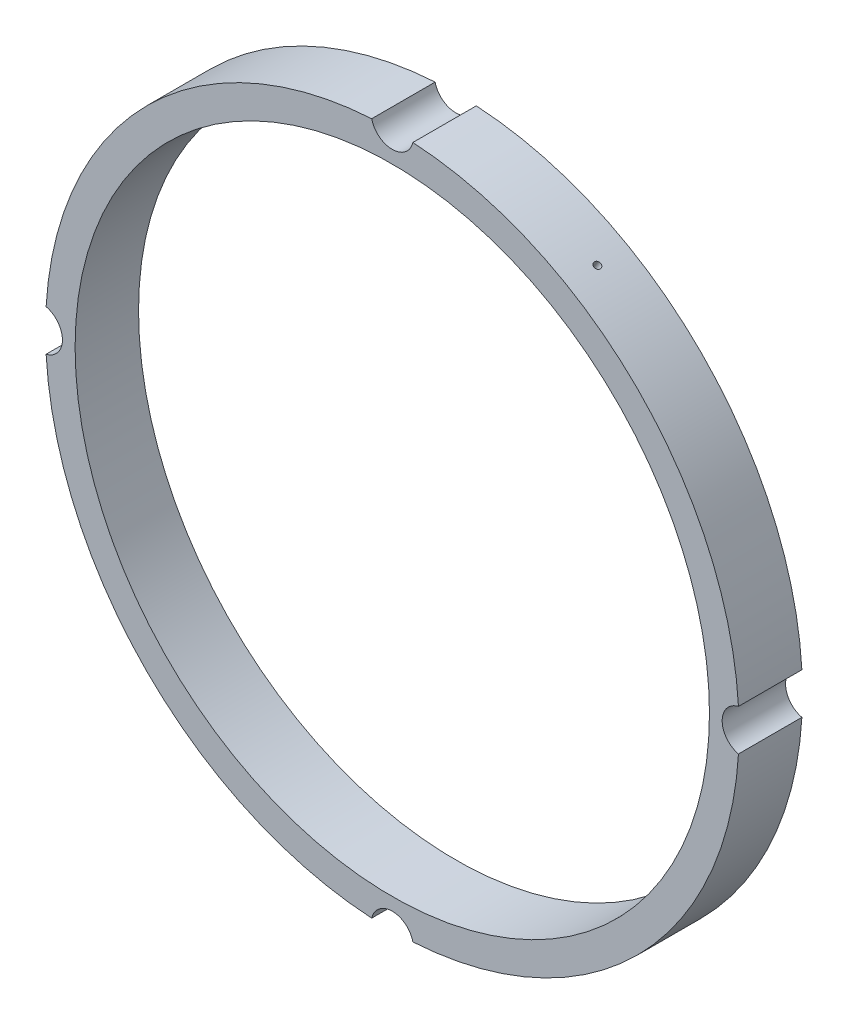
ISO-10303-21;
HEADER;
FILE_DESCRIPTION(('STEP AP214'),'2;1');
FILE_NAME('part.step','',(''),(''),'','','');
FILE_SCHEMA(('AUTOMOTIVE_DESIGN { 1 0 10303 214 1 1 1 1 }'));
ENDSEC;
DATA;
#1=APPLICATION_CONTEXT('core data for automotive mechanical design processes');
#2=APPLICATION_PROTOCOL_DEFINITION('international standard','automotive_design',2000,#1);
#3=PRODUCT_CONTEXT('',#1,'mechanical');
#4=PRODUCT('Part','Part','',(#3));
#5=PRODUCT_RELATED_PRODUCT_CATEGORY('part','',(#4));
#6=PRODUCT_DEFINITION_FORMATION('','',#4);
#7=PRODUCT_DEFINITION_CONTEXT('part definition',#1,'design');
#8=PRODUCT_DEFINITION('design','',#6,#7);
#9=PRODUCT_DEFINITION_SHAPE('','',#8);
#10=(LENGTH_UNIT() NAMED_UNIT(*) SI_UNIT(.MILLI.,.METRE.));
#11=(NAMED_UNIT(*) PLANE_ANGLE_UNIT() SI_UNIT($,.RADIAN.));
#12=(NAMED_UNIT(*) SI_UNIT($,.STERADIAN.) SOLID_ANGLE_UNIT());
#13=UNCERTAINTY_MEASURE_WITH_UNIT(LENGTH_MEASURE(1.E-05),#10,'distance_accuracy_value','');
#14=(GEOMETRIC_REPRESENTATION_CONTEXT(3) GLOBAL_UNCERTAINTY_ASSIGNED_CONTEXT((#13)) GLOBAL_UNIT_ASSIGNED_CONTEXT((#10,
#11,#12)) REPRESENTATION_CONTEXT('',''));
#15=CARTESIAN_POINT('',(0.,0.,0.));
#16=DIRECTION('',(0.,0.,1.));
#17=DIRECTION('',(1.,0.,0.));
#18=AXIS2_PLACEMENT_3D('',#15,#16,#17);
#19=CARTESIAN_POINT('',(0.,0.,15.));
#20=DIRECTION('',(0.,0.,-1.));
#21=DIRECTION('',(-1.,0.,0.));
#22=AXIS2_PLACEMENT_3D('',#19,#20,#21);
#23=CYLINDRICAL_SURFACE('',#22,82.);
#24=CARTESIAN_POINT('',(0.,0.,0.));
#25=DIRECTION('',(0.,0.,1.));
#26=DIRECTION('',(1.,0.,0.));
#27=AXIS2_PLACEMENT_3D('',#24,#25,#26);
#28=CIRCLE('',#27,82.);
#29=CARTESIAN_POINT('',(-4.86723129559619,81.855421686747,0.));
#30=VERTEX_POINT('',#29);
#31=CARTESIAN_POINT('',(-81.8554216867469,4.86723129559705,0.));
#32=VERTEX_POINT('',#31);
#33=EDGE_CURVE('E123',#30,#32,#28,.T.);
#34=ORIENTED_EDGE('',*,*,#33,.T.);
#35=DIRECTION('',(0.,0.,1.));
#36=VECTOR('',#35,1.);
#37=CARTESIAN_POINT('',(-81.8554216867469,4.86723129559704,7.5));
#38=LINE('',#37,#36);
#39=CARTESIAN_POINT('',(-81.8554216867469,4.86723129559704,15.));
#40=VERTEX_POINT('',#39);
#41=EDGE_CURVE('E56',#32,#40,#38,.T.);
#42=ORIENTED_EDGE('',*,*,#41,.T.);
#43=CARTESIAN_POINT('',(0.,0.,15.));
#44=DIRECTION('',(0.,0.,1.));
#45=DIRECTION('',(1.,0.,0.));
#46=AXIS2_PLACEMENT_3D('',#43,#44,#45);
#47=CIRCLE('',#46,82.);
#48=CARTESIAN_POINT('',(-4.86723129559619,81.855421686747,15.));
#49=VERTEX_POINT('',#48);
#50=EDGE_CURVE('E130',#49,#40,#47,.T.);
#51=ORIENTED_EDGE('',*,*,#50,.F.);
#52=DIRECTION('',(0.,0.,1.));
#53=VECTOR('',#52,1.);
#54=CARTESIAN_POINT('',(-4.86723129559619,81.855421686747,7.5));
#55=LINE('',#54,#53);
#56=EDGE_CURVE('E132',#49,#30,#55,.F.);
#57=ORIENTED_EDGE('',*,*,#56,.T.);
#58=EDGE_LOOP('',(#34,#42,#51,#57));
#59=FACE_BOUND('',#58,.T.);
#60=ADVANCED_FACE('F37',(#59),#23,.T.);
#61=CARTESIAN_POINT('',(-81.8554216867471,-4.86723129559533,15.));
#62=VERTEX_POINT('',#61);
#63=CARTESIAN_POINT('',(-4.86723129559619,-81.855421686747,15.));
#64=VERTEX_POINT('',#63);
#65=EDGE_CURVE('E116',#62,#64,#47,.T.);
#66=ORIENTED_EDGE('',*,*,#65,.F.);
#67=DIRECTION('',(0.,0.,1.));
#68=VECTOR('',#67,1.);
#69=CARTESIAN_POINT('',(-81.8554216867471,-4.86723129559533,7.5));
#70=LINE('',#69,#68);
#71=CARTESIAN_POINT('',(-81.8554216867471,-4.86723129559533,0.));
#72=VERTEX_POINT('',#71);
#73=EDGE_CURVE('E107',#62,#72,#70,.F.);
#74=ORIENTED_EDGE('',*,*,#73,.T.);
#75=CARTESIAN_POINT('',(-4.86723129559619,-81.855421686747,0.));
#76=VERTEX_POINT('',#75);
#77=EDGE_CURVE('E64',#72,#76,#28,.T.);
#78=ORIENTED_EDGE('',*,*,#77,.T.);
#79=DIRECTION('',(0.,0.,1.));
#80=VECTOR('',#79,1.);
#81=CARTESIAN_POINT('',(-4.86723129559619,-81.855421686747,7.5));
#82=LINE('',#81,#80);
#83=EDGE_CURVE('E161',#76,#64,#82,.T.);
#84=ORIENTED_EDGE('',*,*,#83,.T.);
#85=EDGE_LOOP('',(#66,#74,#78,#84));
#86=FACE_BOUND('',#85,.T.);
#87=ADVANCED_FACE('F115',(#86),#23,.T.);
#88=CARTESIAN_POINT('',(4.86723129559619,-81.855421686747,15.));
#89=VERTEX_POINT('',#88);
#90=CARTESIAN_POINT('',(81.855421686747,-4.86723129559647,15.));
#91=VERTEX_POINT('',#90);
#92=EDGE_CURVE('E146',#89,#91,#47,.T.);
#93=ORIENTED_EDGE('',*,*,#92,.F.);
#94=DIRECTION('',(0.,0.,1.));
#95=VECTOR('',#94,1.);
#96=CARTESIAN_POINT('',(4.86723129559619,-81.855421686747,7.5));
#97=LINE('',#96,#95);
#98=CARTESIAN_POINT('',(4.86723129559619,-81.855421686747,0.));
#99=VERTEX_POINT('',#98);
#100=EDGE_CURVE('E214',#89,#99,#97,.F.);
#101=ORIENTED_EDGE('',*,*,#100,.T.);
#102=CARTESIAN_POINT('',(81.855421686747,-4.86723129559647,0.));
#103=VERTEX_POINT('',#102);
#104=EDGE_CURVE('E124',#99,#103,#28,.T.);
#105=ORIENTED_EDGE('',*,*,#104,.T.);
#106=DIRECTION('',(0.,0.,1.));
#107=VECTOR('',#106,1.);
#108=CARTESIAN_POINT('',(81.855421686747,-4.86723129559647,7.5));
#109=LINE('',#108,#107);
#110=EDGE_CURVE('E49',#103,#91,#109,.T.);
#111=ORIENTED_EDGE('',*,*,#110,.T.);
#112=EDGE_LOOP('',(#93,#101,#105,#111));
#113=FACE_BOUND('',#112,.T.);
#114=ADVANCED_FACE('F144',(#113),#23,.T.);
#115=CARTESIAN_POINT('',(0.,0.,15.));
#116=DIRECTION('',(0.,0.,1.));
#117=DIRECTION('',(1.,0.,0.));
#118=AXIS2_PLACEMENT_3D('',#115,#116,#117);
#119=PLANE('',#118);
#120=CARTESIAN_POINT('',(-83.,8.6937885337194E-13,15.));
#121=DIRECTION('',(0.,0.,1.));
#122=DIRECTION('',(0.,1.,0.));
#123=AXIS2_PLACEMENT_3D('',#120,#121,#122);
#124=CIRCLE('',#123,5.);
#125=EDGE_CURVE('E112',#62,#40,#124,.T.);
#126=ORIENTED_EDGE('',*,*,#125,.F.);
#127=ORIENTED_EDGE('',*,*,#65,.T.);
#128=CARTESIAN_POINT('',(0.,-83.,15.));
#129=DIRECTION('',(0.,0.,1.));
#130=DIRECTION('',(-1.,0.,0.));
#131=AXIS2_PLACEMENT_3D('',#128,#129,#130);
#132=CIRCLE('',#131,5.);
#133=EDGE_CURVE('E206',#89,#64,#132,.T.);
#134=ORIENTED_EDGE('',*,*,#133,.F.);
#135=ORIENTED_EDGE('',*,*,#92,.T.);
#136=CARTESIAN_POINT('',(83.,-2.8979295112398E-13,15.));
#137=DIRECTION('',(0.,0.,1.));
#138=DIRECTION('',(0.,-1.,0.));
#139=AXIS2_PLACEMENT_3D('',#136,#137,#138);
#140=CIRCLE('',#139,5.);
#141=CARTESIAN_POINT('',(81.855421686747,4.8672312955959,15.));
#142=VERTEX_POINT('',#141);
#143=EDGE_CURVE('E153',#142,#91,#140,.T.);
#144=ORIENTED_EDGE('',*,*,#143,.F.);
#145=CARTESIAN_POINT('',(4.86723129559619,81.855421686747,15.));
#146=VERTEX_POINT('',#145);
#147=EDGE_CURVE('E126',#142,#146,#47,.T.);
#148=ORIENTED_EDGE('',*,*,#147,.T.);
#149=CARTESIAN_POINT('',(0.,83.,15.));
#150=DIRECTION('',(0.,0.,1.));
#151=DIRECTION('',(1.,0.,0.));
#152=AXIS2_PLACEMENT_3D('',#149,#150,#151);
#153=CIRCLE('',#152,5.);
#154=EDGE_CURVE('E156',#49,#146,#153,.T.);
#155=ORIENTED_EDGE('',*,*,#154,.F.);
#156=ORIENTED_EDGE('',*,*,#50,.T.);
#157=EDGE_LOOP('',(#126,#127,#134,#135,#144,#148,#155,#156));
#158=FACE_BOUND('',#157,.T.);
#159=CARTESIAN_POINT('',(0.,0.,15.));
#160=DIRECTION('',(0.,0.,1.));
#161=DIRECTION('',(1.,0.,0.));
#162=AXIS2_PLACEMENT_3D('',#159,#160,#161);
#163=CIRCLE('',#162,75.);
#164=CARTESIAN_POINT('',(75.,0.,15.));
#165=VERTEX_POINT('',#164);
#166=EDGE_CURVE('E168',#165,#165,#163,.T.);
#167=ORIENTED_EDGE('',*,*,#166,.F.);
#168=EDGE_LOOP('',(#167));
#169=FACE_BOUND('',#168,.T.);
#170=ADVANCED_FACE('F202',(#158,#169),#119,.T.);
#171=CARTESIAN_POINT('',(0.,0.,0.));
#172=DIRECTION('',(0.,0.,1.));
#173=DIRECTION('',(1.,0.,0.));
#174=AXIS2_PLACEMENT_3D('',#171,#172,#173);
#175=PLANE('',#174);
#176=ORIENTED_EDGE('',*,*,#77,.F.);
#177=CARTESIAN_POINT('',(-83.,8.6937885337194E-13,0.));
#178=DIRECTION('',(0.,0.,1.));
#179=DIRECTION('',(0.,1.,0.));
#180=AXIS2_PLACEMENT_3D('',#177,#178,#179);
#181=CIRCLE('',#180,5.);
#182=EDGE_CURVE('E105',#72,#32,#181,.T.);
#183=ORIENTED_EDGE('',*,*,#182,.T.);
#184=ORIENTED_EDGE('',*,*,#33,.F.);
#185=CARTESIAN_POINT('',(0.,83.,0.));
#186=DIRECTION('',(0.,0.,1.));
#187=DIRECTION('',(1.,0.,0.));
#188=AXIS2_PLACEMENT_3D('',#185,#186,#187);
#189=CIRCLE('',#188,5.);
#190=CARTESIAN_POINT('',(4.86723129559619,81.855421686747,0.));
#191=VERTEX_POINT('',#190);
#192=EDGE_CURVE('E159',#30,#191,#189,.T.);
#193=ORIENTED_EDGE('',*,*,#192,.T.);
#194=CARTESIAN_POINT('',(81.855421686747,4.8672312955959,0.));
#195=VERTEX_POINT('',#194);
#196=EDGE_CURVE('E127',#195,#191,#28,.T.);
#197=ORIENTED_EDGE('',*,*,#196,.F.);
#198=CARTESIAN_POINT('',(83.,-2.8979295112398E-13,0.));
#199=DIRECTION('',(0.,0.,1.));
#200=DIRECTION('',(0.,-1.,0.));
#201=AXIS2_PLACEMENT_3D('',#198,#199,#200);
#202=CIRCLE('',#201,5.);
#203=EDGE_CURVE('E151',#195,#103,#202,.T.);
#204=ORIENTED_EDGE('',*,*,#203,.T.);
#205=ORIENTED_EDGE('',*,*,#104,.F.);
#206=CARTESIAN_POINT('',(0.,-83.,0.));
#207=DIRECTION('',(0.,0.,1.));
#208=DIRECTION('',(-1.,0.,0.));
#209=AXIS2_PLACEMENT_3D('',#206,#207,#208);
#210=CIRCLE('',#209,5.);
#211=EDGE_CURVE('E122',#99,#76,#210,.T.);
#212=ORIENTED_EDGE('',*,*,#211,.T.);
#213=EDGE_LOOP('',(#176,#183,#184,#193,#197,#204,#205,#212));
#214=FACE_BOUND('',#213,.T.);
#215=CARTESIAN_POINT('',(0.,0.,0.));
#216=DIRECTION('',(0.,0.,1.));
#217=DIRECTION('',(1.,0.,0.));
#218=AXIS2_PLACEMENT_3D('',#215,#216,#217);
#219=CIRCLE('',#218,75.);
#220=CARTESIAN_POINT('',(75.,0.,0.));
#221=VERTEX_POINT('',#220);
#222=EDGE_CURVE('E166',#221,#221,#219,.T.);
#223=ORIENTED_EDGE('',*,*,#222,.T.);
#224=EDGE_LOOP('',(#223));
#225=FACE_BOUND('',#224,.T.);
#226=ADVANCED_FACE('F119',(#214,#225),#175,.F.);
#227=CARTESIAN_POINT('',(40.3052284110281,71.4107034185693,7.5));
#228=CARTESIAN_POINT('',(40.305230162785,71.4107024681233,7.45506479609301));
#229=CARTESIAN_POINT('',(40.3085368078791,71.40883642493,7.41009703714874));
#230=CARTESIAN_POINT('',(40.3216802135916,71.4014156688339,7.32140003350558));
#231=CARTESIAN_POINT('',(40.3315248278901,71.3958565196163,7.2776723443821));
#232=CARTESIAN_POINT('',(40.3574592527584,71.3811999286591,7.19275330768963));
#233=CARTESIAN_POINT('',(40.3735460727166,71.3721041812829,7.15156075648079));
#234=CARTESIAN_POINT('',(40.4114971299767,71.3506227921757,7.07287429083479));
#235=CARTESIAN_POINT('',(40.4333599334488,71.3382379669211,7.03537946164327));
#236=CARTESIAN_POINT('',(40.4822388609424,71.3105120161913,6.9651344354136));
#237=CARTESIAN_POINT('',(40.5092556770344,71.2951704936937,6.93238487660122));
#238=CARTESIAN_POINT('',(40.5676657214676,71.2619507473826,6.87256517048709));
#239=CARTESIAN_POINT('',(40.59905912185,71.2440724238483,6.84549524655357));
#240=CARTESIAN_POINT('',(40.6653214679689,71.2062713712898,6.79780471692709));
#241=CARTESIAN_POINT('',(40.7001904182244,71.1863486396075,6.77718411961991));
#242=CARTESIAN_POINT('',(40.772406334745,71.1450111456782,6.74297779787522));
#243=CARTESIAN_POINT('',(40.8097532955037,71.1235963867468,6.72939205780614));
#244=CARTESIAN_POINT('',(40.8858585322044,71.0798740635081,6.70964144378451));
#245=CARTESIAN_POINT('',(40.9246167652487,71.0575665263361,6.70347634446412));
#246=CARTESIAN_POINT('',(41.0024427076472,71.0126869615936,6.69874133559804));
#247=CARTESIAN_POINT('',(41.0415104163721,70.9901149345609,6.70017141060814));
#248=CARTESIAN_POINT('',(41.1188455717403,70.945348935138,6.71058592631372));
#249=CARTESIAN_POINT('',(41.1571130452983,70.9231549500377,6.71957011251892));
#250=CARTESIAN_POINT('',(41.2317665366884,70.8797805669154,6.7448374350582));
#251=CARTESIAN_POINT('',(41.2681525523058,70.8586001700864,6.76112057998316));
#252=CARTESIAN_POINT('',(41.3380172194721,70.8178647619419,6.80052388209611));
#253=CARTESIAN_POINT('',(41.3714958216182,70.7983097782456,6.82364415543103));
#254=CARTESIAN_POINT('',(41.434603016724,70.7613949232539,6.87606530348475));
#255=CARTESIAN_POINT('',(41.4642316101463,70.7440350516948,6.90536617746084));
#256=CARTESIAN_POINT('',(41.5188083007378,70.7120185025764,6.9693182281911));
#257=CARTESIAN_POINT('',(41.5437562021976,70.6973619380483,7.00396962855131));
#258=CARTESIAN_POINT('',(41.5882710512857,70.6711849340483,7.07763829735254));
#259=CARTESIAN_POINT('',(41.6078379981956,70.6596644949952,7.11665556637643));
#260=CARTESIAN_POINT('',(41.641043626485,70.640100926749,7.19794850712354));
#261=CARTESIAN_POINT('',(41.6546823022913,70.6320578008251,7.24022418191001));
#262=CARTESIAN_POINT('',(41.6756502729947,70.6196879331484,7.3268337992777));
#263=CARTESIAN_POINT('',(41.6829795699621,70.6153611901761,7.37116774118354));
#264=CARTESIAN_POINT('',(41.6911239668386,70.6105530728755,7.46063342804992));
#265=CARTESIAN_POINT('',(41.6919393353669,70.6100715399797,7.50576514003536));
#266=CARTESIAN_POINT('',(41.6870338226723,70.6129677812092,7.59554693556317));
#267=CARTESIAN_POINT('',(41.6813129419862,70.6163455550177,7.64019701914508));
#268=CARTESIAN_POINT('',(41.6634948178797,70.6268596602105,7.72774720890134));
#269=CARTESIAN_POINT('',(41.6513976958952,70.6339959200141,7.77064734838672));
#270=CARTESIAN_POINT('',(41.6211650638207,70.6518147314161,7.8534808607507));
#271=CARTESIAN_POINT('',(41.6030295531477,70.6624972833568,7.89341423334282));
#272=CARTESIAN_POINT('',(41.5612265203059,70.6870924286367,7.96918206255699));
#273=CARTESIAN_POINT('',(41.537558817141,70.7010051276562,8.00501638501377));
#274=CARTESIAN_POINT('',(41.4853544455829,70.7316497769729,8.07156755198845));
#275=CARTESIAN_POINT('',(41.4568177741148,70.7483817290505,8.10228439327472));
#276=CARTESIAN_POINT('',(41.3956750206665,70.7841743762166,8.15772966893016));
#277=CARTESIAN_POINT('',(41.3630688010143,70.8032351500882,8.18245790062276));
#278=CARTESIAN_POINT('',(41.2947046718655,70.8431290267123,8.22522259144113));
#279=CARTESIAN_POINT('',(41.2589467660966,70.8639621273686,8.24325905848161));
#280=CARTESIAN_POINT('',(41.1852880913143,70.9067969831621,8.27212789441348));
#281=CARTESIAN_POINT('',(41.1473873619883,70.9287987166545,8.2829603966825));
#282=CARTESIAN_POINT('',(41.0705139344065,70.9733390629306,8.29711425167829));
#283=CARTESIAN_POINT('',(41.0315412345227,70.9958776765296,8.30043559299621));
#284=CARTESIAN_POINT('',(40.9536306752187,71.0408485140235,8.29947279646204));
#285=CARTESIAN_POINT('',(40.9146928143604,71.0632807424909,8.2951889885238));
#286=CARTESIAN_POINT('',(40.8379572703114,71.1074061241529,8.279138152379));
#287=CARTESIAN_POINT('',(40.8001595894107,71.129099275863,8.26737110914375));
#288=CARTESIAN_POINT('',(40.7267814451327,71.1711392536284,8.23668763250792));
#289=CARTESIAN_POINT('',(40.6912010228659,71.1914860547211,8.21777106659268));
#290=CARTESIAN_POINT('',(40.6232765406942,71.2302669838026,8.17332635454546));
#291=CARTESIAN_POINT('',(40.5909323548439,71.2487011862253,8.14779846584659));
#292=CARTESIAN_POINT('',(40.5304074104666,71.2831487094411,8.09085755066491));
#293=CARTESIAN_POINT('',(40.5022263893502,71.2991621829217,8.05944489564427));
#294=CARTESIAN_POINT('',(40.4508278504761,71.328335198352,7.99161477008843));
#295=CARTESIAN_POINT('',(40.4276115676375,71.3414940302556,7.95519605804872));
#296=CARTESIAN_POINT('',(40.3868099222115,71.3646000206399,7.87838044791628));
#297=CARTESIAN_POINT('',(40.3692273551643,71.3745455846659,7.83798158776967));
#298=CARTESIAN_POINT('',(40.340231691055,71.3909377104108,7.75439747070503));
#299=CARTESIAN_POINT('',(40.3288112020707,71.3973884644812,7.71121562216788));
#300=CARTESIAN_POINT('',(40.3155112248783,71.4048988976244,7.63979902324665));
#301=CARTESIAN_POINT('',(40.3116600520628,71.4070729879977,7.61202827082364));
#302=CARTESIAN_POINT('',(40.3065180975612,71.4099755455663,7.55617592082972));
#303=CARTESIAN_POINT('',(40.3052273157971,71.4107040128057,7.52809432326828));
#304=CARTESIAN_POINT('',(40.3052284110281,71.4107034185693,7.5));
#305=B_SPLINE_CURVE_WITH_KNOTS('',3,(#227,#228,#229,#230,#231,#232,#233,#234,#235,#236,#237,
#238,#239,#240,#241,#242,#243,#244,#245,#246,#247,#248,#249,#250,#251,#252,#253,#254,#255,#256,
#257,#258,#259,#260,#261,#262,#263,#264,#265,#266,#267,#268,#269,#270,#271,#272,#273,#274,#275,
#276,#277,#278,#279,#280,#281,#282,#283,#284,#285,#286,#287,#288,#289,#290,#291,#292,#293,#294,
#295,#296,#297,#298,#299,#300,#301,#302,#303,#304),.UNSPECIFIED.,.T.,.F.,(4,2,2,2,2,2,2,2,2,2,2,
2,2,2,2,2,2,2,2,2,2,2,2,2,2,2,2,2,2,2,2,2,2,2,2,2,2,2,4),(0.,0.134703067123951,
0.269568238553242,0.404368876326957,0.539136082591843,0.673921397882172,0.808712013005293,
0.943502803389999,1.07829329426615,1.21307969139774,1.3478658144514,1.4826473968801,
1.61742913794745,1.75221316877516,1.88699718340582,2.02178683237555,2.15657649934034,
2.29136629302324,2.426156042478,2.56094023348925,2.69572441343266,2.83050602649563,
2.96528765257389,3.10007368890393,3.23485981034963,3.36965049281604,3.50444101585779,
3.639229043254,3.77401727538222,3.90879966049609,4.04358231629638,4.1783674703827,
4.31314737696436,4.44791877874285,4.58272366439784,4.71759533917825,4.85230486249334,
4.93652372208243,5.02074257910246),.UNSPECIFIED.);
#306=CARTESIAN_POINT('',(40.3052284110281,71.4107034185693,7.5));
#307=VERTEX_POINT('',#306);
#308=EDGE_CURVE('E11',#307,#307,#305,.T.);
#309=ORIENTED_EDGE('',*,*,#308,.T.);
#310=EDGE_LOOP('',(#309));
#311=FACE_BOUND('',#310,.T.);
#312=ORIENTED_EDGE('',*,*,#147,.F.);
#313=DIRECTION('',(0.,0.,1.));
#314=VECTOR('',#313,1.);
#315=CARTESIAN_POINT('',(81.855421686747,4.8672312955959,7.5));
#316=LINE('',#315,#314);
#317=EDGE_CURVE('E138',#142,#195,#316,.F.);
#318=ORIENTED_EDGE('',*,*,#317,.T.);
#319=ORIENTED_EDGE('',*,*,#196,.T.);
#320=DIRECTION('',(0.,0.,1.));
#321=VECTOR('',#320,1.);
#322=CARTESIAN_POINT('',(4.86723129559619,81.855421686747,7.5));
#323=LINE('',#322,#321);
#324=EDGE_CURVE('E135',#191,#146,#323,.T.);
#325=ORIENTED_EDGE('',*,*,#324,.T.);
#326=EDGE_LOOP('',(#312,#318,#319,#325));
#327=FACE_BOUND('',#326,.T.);
#328=ADVANCED_FACE('F39',(#311,#327),#23,.T.);
#329=CARTESIAN_POINT('',(0.,0.,15.));
#330=DIRECTION('',(0.,0.,-1.));
#331=DIRECTION('',(-1.,0.,0.));
#332=AXIS2_PLACEMENT_3D('',#329,#330,#331);
#333=CYLINDRICAL_SURFACE('',#332,75.);
#334=CARTESIAN_POINT('',(36.8050462829542,65.3482101370007,7.5));
#335=CARTESIAN_POINT('',(36.8050480371068,65.3482091908556,7.4550650202504));
#336=CARTESIAN_POINT('',(36.8083563893281,65.3463461799556,7.41009749094246));
#337=CARTESIAN_POINT('',(36.8215064307599,65.3389372344705,7.32140095562176));
#338=CARTESIAN_POINT('',(36.8313559762903,65.3333868711768,7.27767350494019));
#339=CARTESIAN_POINT('',(36.8573029001601,65.3187526175866,7.19275494634586));
#340=CARTESIAN_POINT('',(36.8733972851322,65.3096704202157,7.15156263419737));
#341=CARTESIAN_POINT('',(36.9113652327449,65.2882193796654,7.07287659923403));
#342=CARTESIAN_POINT('',(36.9332373616623,65.275851351847,7.035381962022));
#343=CARTESIAN_POINT('',(36.9821357786632,65.2481602840425,6.96513702906338));
#344=CARTESIAN_POINT('',(37.0091627888349,65.2328368300614,6.93238739912278));
#345=CARTESIAN_POINT('',(37.0675928290538,65.1996525164563,6.87256749931847));
#346=CARTESIAN_POINT('',(37.0989960311762,65.1817915570551,6.84549745288538));
#347=CARTESIAN_POINT('',(37.165276621277,65.1440224914367,6.79780653018475));
#348=CARTESIAN_POINT('',(37.2001540272983,65.1241143745878,6.77718568741294));
#349=CARTESIAN_POINT('',(37.2723844475244,65.0828017747338,6.74297889347224));
#350=CARTESIAN_POINT('',(37.309737456126,65.0613972951156,6.72939292638149));
#351=CARTESIAN_POINT('',(37.3858514560471,65.0176901750221,6.70964196631049));
#352=CARTESIAN_POINT('',(37.4246123956757,64.9953875675174,6.70347670116969));
#353=CARTESIAN_POINT('',(37.5024403148383,64.9505118372576,6.69874132894007));
#354=CARTESIAN_POINT('',(37.541507293736,64.9279387150649,6.70017120606366));
#355=CARTESIAN_POINT('',(37.6188373554943,64.8831647861721,6.71058526118988));
#356=CARTESIAN_POINT('',(37.6571004707224,64.8609639644887,6.71956913443268));
#357=CARTESIAN_POINT('',(37.7317423544195,64.8175707954564,6.74483569725782));
#358=CARTESIAN_POINT('',(37.7681211206258,64.7963784493184,6.76111839560381));
#359=CARTESIAN_POINT('',(37.8379693340923,64.7556153066755,6.8005207415664));
#360=CARTESIAN_POINT('',(37.8714387220741,64.7360445432105,6.82364052844561));
#361=CARTESIAN_POINT('',(37.934526459754,64.6990961367939,6.8760606377374));
#362=CARTESIAN_POINT('',(37.9641448097006,64.6817184937006,6.90536095975093));
#363=CARTESIAN_POINT('',(38.0187013917973,64.6496662631315,6.96931214094038));
#364=CARTESIAN_POINT('',(38.0436393901331,64.6349918106984,7.00396326726653));
#365=CARTESIAN_POINT('',(38.0881356631969,64.6087810653332,7.07763147675293));
#366=CARTESIAN_POINT('',(38.1076939372037,64.597244772822,7.11664856049856));
#367=CARTESIAN_POINT('',(38.1408844541449,64.5776533045459,7.19794124937334));
#368=CARTESIAN_POINT('',(38.1545166903564,64.5695981327303,7.24021685819908));
#369=CARTESIAN_POINT('',(38.1754747513236,64.5572093338679,7.32682645392058));
#370=CARTESIAN_POINT('',(38.1828005784973,64.5528757053942,7.37116044002704));
#371=CARTESIAN_POINT('',(38.1909413824111,64.5480597632868,7.46062594210085));
#372=CARTESIAN_POINT('',(38.1917566800836,64.5475772598144,7.50575741864649));
#373=CARTESIAN_POINT('',(38.1868545475179,64.5504775161813,7.59553881341012));
#374=CARTESIAN_POINT('',(38.1811371179785,64.5538602756073,7.64018873167963));
#375=CARTESIAN_POINT('',(38.1633291083601,64.5643896994272,7.72773849669129));
#376=CARTESIAN_POINT('',(38.1512386734367,64.5715362780939,7.77063838326933));
#377=CARTESIAN_POINT('',(38.121021943817,64.58937987047,7.85347150366394));
#378=CARTESIAN_POINT('',(38.1028956482698,64.6000768846797,7.89340473706236));
#379=CARTESIAN_POINT('',(38.0611124544012,64.6247035165116,7.96917268708774));
#380=CARTESIAN_POINT('',(38.0374553396379,64.6386332606425,8.00500724323626));
#381=CARTESIAN_POINT('',(37.9852724588776,64.6693125821188,8.07155900623288));
#382=CARTESIAN_POINT('',(37.9567466895903,64.6860621613697,8.10227620962269));
#383=CARTESIAN_POINT('',(37.8956246465006,64.7218887639564,8.15772253126949));
#384=CARTESIAN_POINT('',(37.863028208343,64.7409658812668,8.1824514076266));
#385=CARTESIAN_POINT('',(37.7946816007971,64.7808892105927,8.22521742401462));
#386=CARTESIAN_POINT('',(37.7589314352171,64.8017354204719,8.2432545721263));
#387=CARTESIAN_POINT('',(37.6852854659991,64.8445917012878,8.27212471767835));
#388=CARTESIAN_POINT('',(37.6473897097049,64.8666017465431,8.28295787401225));
#389=CARTESIAN_POINT('',(37.570522798859,64.9111530416104,8.29711304961452));
#390=CARTESIAN_POINT('',(37.5315516427333,64.9336942922,8.30043505788946));
#391=CARTESIAN_POINT('',(37.4536409057876,64.9786642363913,8.29947358692461));
#392=CARTESIAN_POINT('',(37.4147013234452,65.0010929357281,8.29519049922343));
#393=CARTESIAN_POINT('',(37.3379589704716,65.0452056620496,8.27914120179627));
#394=CARTESIAN_POINT('',(37.3001562021231,65.0668896875391,8.26737497704568));
#395=CARTESIAN_POINT('',(37.2267650922114,65.1089068431069,8.23669322600969));
#396=CARTESIAN_POINT('',(37.1911767916611,65.1292399481661,8.21777756735918));
#397=CARTESIAN_POINT('',(37.1232346218809,65.1679904761977,8.17333473728467));
#398=CARTESIAN_POINT('',(37.0908806269882,65.1864079735984,8.14780782286669));
#399=CARTESIAN_POINT('',(37.0303349483126,65.2208211267837,8.09086865031062));
#400=CARTESIAN_POINT('',(37.0021430357465,65.236816915687,8.05945671587823));
#401=CARTESIAN_POINT('',(36.9507230753817,65.2659554454819,7.99162792346797));
#402=CARTESIAN_POINT('',(36.9274962624952,65.2790974766038,7.95520982405611));
#403=CARTESIAN_POINT('',(36.886674973326,65.3021727146869,7.87839515111328));
#404=CARTESIAN_POINT('',(36.8690833131314,65.3121043173042,7.8379966015531));
#405=CARTESIAN_POINT('',(36.8400719807352,65.3284729390554,7.75441290469288));
#406=CARTESIAN_POINT('',(36.8286449144051,65.3349141447912,7.71123116563503));
#407=CARTESIAN_POINT('',(36.8153363830033,65.3424137824977,7.63981210935175));
#408=CARTESIAN_POINT('',(36.8114824882576,65.3445848245014,7.61203879602761));
#409=CARTESIAN_POINT('',(36.8063368898609,65.3474832975298,7.55618123049376));
#410=CARTESIAN_POINT('',(36.8050451861163,65.3482107286071,7.52809697829541));
#411=CARTESIAN_POINT('',(36.8050462829542,65.3482101370007,7.5));
#412=B_SPLINE_CURVE_WITH_KNOTS('',3,(#334,#335,#336,#337,#338,#339,#340,#341,#342,#343,#344,
#345,#346,#347,#348,#349,#350,#351,#352,#353,#354,#355,#356,#357,#358,#359,#360,#361,#362,#363,
#364,#365,#366,#367,#368,#369,#370,#371,#372,#373,#374,#375,#376,#377,#378,#379,#380,#381,#382,
#383,#384,#385,#386,#387,#388,#389,#390,#391,#392,#393,#394,#395,#396,#397,#398,#399,#400,#401,
#402,#403,#404,#405,#406,#407,#408,#409,#410,#411),.UNSPECIFIED.,.T.,.F.,(4,2,2,2,2,2,2,2,2,2,2,
2,2,2,2,2,2,2,2,2,2,2,2,2,2,2,2,2,2,2,2,2,2,2,2,2,2,2,4),(0.,0.134702384884244,
0.269566847771312,0.40436674516063,0.539133223883879,0.673918594382309,0.8087092662439,
0.943500638166865,1.07829170501872,1.21307782814302,1.34786367109515,1.48264407648283,
1.61742464370114,1.75220795641378,1.88699126042393,2.02178129595246,2.15657134955318,
2.29136155606753,2.42615171089689,2.56093522128892,2.69571871726381,2.83049914345483,
2.96527958864289,3.10006530918112,3.2348511208066,3.36964237622914,3.50443346888079,
3.63922158843893,3.7740099052748,3.90879128290839,4.04357293115624,4.17835707488293,
4.31313597979599,4.44790747336683,4.58271244820657,4.71758468521551,4.8522947878496,
4.93652160053771,5.02074841015293),.UNSPECIFIED.);
#413=CARTESIAN_POINT('',(36.8050462829542,65.3482101370007,7.5));
#414=VERTEX_POINT('',#413);
#415=EDGE_CURVE('E207',#414,#414,#412,.T.);
#416=ORIENTED_EDGE('',*,*,#415,.F.);
#417=EDGE_LOOP('',(#416));
#418=FACE_BOUND('',#417,.T.);
#419=ORIENTED_EDGE('',*,*,#166,.T.);
#420=EDGE_LOOP('',(#419));
#421=FACE_BOUND('',#420,.T.);
#422=ORIENTED_EDGE('',*,*,#222,.F.);
#423=EDGE_LOOP('',(#422));
#424=FACE_BOUND('',#423,.T.);
#425=ADVANCED_FACE('F173',(#418,#421,#424),#333,.F.);
#426=CARTESIAN_POINT('',(0.,83.,0.));
#427=DIRECTION('',(0.,0.,1.));
#428=DIRECTION('',(1.,0.,0.));
#429=AXIS2_PLACEMENT_3D('',#426,#427,#428);
#430=CYLINDRICAL_SURFACE('',#429,5.);
#431=ORIENTED_EDGE('',*,*,#192,.F.);
#432=ORIENTED_EDGE('',*,*,#56,.F.);
#433=ORIENTED_EDGE('',*,*,#154,.T.);
#434=ORIENTED_EDGE('',*,*,#324,.F.);
#435=EDGE_LOOP('',(#431,#432,#433,#434));
#436=FACE_BOUND('',#435,.T.);
#437=ADVANCED_FACE('F175',(#436),#430,.F.);
#438=CARTESIAN_POINT('',(83.,-2.8979295112398E-13,0.));
#439=DIRECTION('',(0.,0.,1.));
#440=DIRECTION('',(1.,0.,0.));
#441=AXIS2_PLACEMENT_3D('',#438,#439,#440);
#442=CYLINDRICAL_SURFACE('',#441,5.);
#443=ORIENTED_EDGE('',*,*,#203,.F.);
#444=ORIENTED_EDGE('',*,*,#317,.F.);
#445=ORIENTED_EDGE('',*,*,#143,.T.);
#446=ORIENTED_EDGE('',*,*,#110,.F.);
#447=EDGE_LOOP('',(#443,#444,#445,#446));
#448=FACE_BOUND('',#447,.T.);
#449=ADVANCED_FACE('F150',(#448),#442,.F.);
#450=CARTESIAN_POINT('',(0.,-83.,0.));
#451=DIRECTION('',(0.,0.,1.));
#452=DIRECTION('',(1.,0.,0.));
#453=AXIS2_PLACEMENT_3D('',#450,#451,#452);
#454=CYLINDRICAL_SURFACE('',#453,5.);
#455=ORIENTED_EDGE('',*,*,#211,.F.);
#456=ORIENTED_EDGE('',*,*,#100,.F.);
#457=ORIENTED_EDGE('',*,*,#133,.T.);
#458=ORIENTED_EDGE('',*,*,#83,.F.);
#459=EDGE_LOOP('',(#455,#456,#457,#458));
#460=FACE_BOUND('',#459,.T.);
#461=ADVANCED_FACE('F216',(#460),#454,.F.);
#462=CARTESIAN_POINT('',(-83.,8.6937885337194E-13,0.));
#463=DIRECTION('',(0.,0.,1.));
#464=DIRECTION('',(1.,0.,0.));
#465=AXIS2_PLACEMENT_3D('',#462,#463,#464);
#466=CYLINDRICAL_SURFACE('',#465,5.);
#467=ORIENTED_EDGE('',*,*,#182,.F.);
#468=ORIENTED_EDGE('',*,*,#73,.F.);
#469=ORIENTED_EDGE('',*,*,#125,.T.);
#470=ORIENTED_EDGE('',*,*,#41,.F.);
#471=EDGE_LOOP('',(#467,#468,#469,#470));
#472=FACE_BOUND('',#471,.T.);
#473=ADVANCED_FACE('F106',(#472),#466,.F.);
#474=CARTESIAN_POINT('',(41.,71.014083110324,7.5));
#475=DIRECTION('',(0.5,0.866025403784439,0.));
#476=DIRECTION('',(-0.866025403784439,0.5,0.));
#477=AXIS2_PLACEMENT_3D('',#474,#475,#476);
#478=CYLINDRICAL_SURFACE('',#477,0.799999999999989);
#479=ORIENTED_EDGE('',*,*,#415,.T.);
#480=EDGE_LOOP('',(#479));
#481=FACE_BOUND('',#480,.T.);
#482=ORIENTED_EDGE('',*,*,#308,.F.);
#483=EDGE_LOOP('',(#482));
#484=FACE_BOUND('',#483,.T.);
#485=ADVANCED_FACE('F223',(#481,#484),#478,.F.);
#486=CLOSED_SHELL('',(#60,#87,#114,#170,#226,#328,#425,#437,#449,#461,#473,#485));
#487=MANIFOLD_SOLID_BREP('B2',#486);
#488=ADVANCED_BREP_SHAPE_REPRESENTATION('',(#18,#487),#14);
#489=SHAPE_DEFINITION_REPRESENTATION(#9,#488);
ENDSEC;
END-ISO-10303-21;
